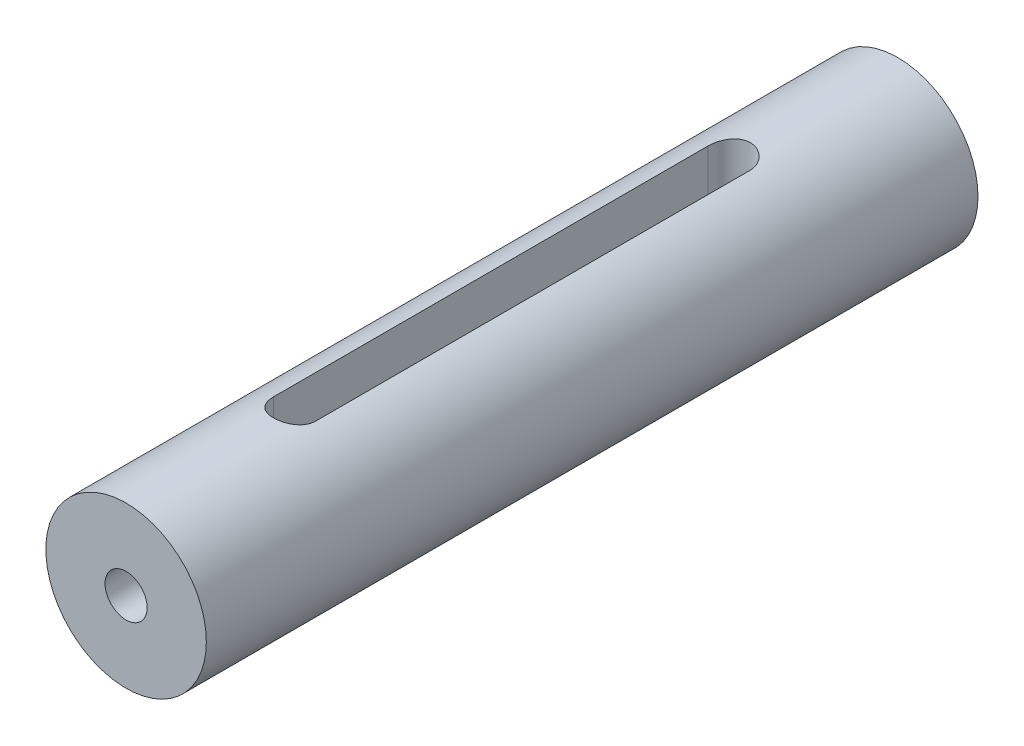
ISO-10303-21;
HEADER;
FILE_DESCRIPTION(('STEP AP214'),'2;1');
FILE_NAME('part.step','',(''),(''),'','','');
FILE_SCHEMA(('AUTOMOTIVE_DESIGN { 1 0 10303 214 1 1 1 1 }'));
ENDSEC;
DATA;
#1=APPLICATION_CONTEXT('core data for automotive mechanical design processes');
#2=APPLICATION_PROTOCOL_DEFINITION('international standard','automotive_design',2000,#1);
#3=PRODUCT_CONTEXT('',#1,'mechanical');
#4=PRODUCT('Part','Part','',(#3));
#5=PRODUCT_RELATED_PRODUCT_CATEGORY('part','',(#4));
#6=PRODUCT_DEFINITION_FORMATION('','',#4);
#7=PRODUCT_DEFINITION_CONTEXT('part definition',#1,'design');
#8=PRODUCT_DEFINITION('design','',#6,#7);
#9=PRODUCT_DEFINITION_SHAPE('','',#8);
#10=(LENGTH_UNIT() NAMED_UNIT(*) SI_UNIT(.MILLI.,.METRE.));
#11=(NAMED_UNIT(*) PLANE_ANGLE_UNIT() SI_UNIT($,.RADIAN.));
#12=(NAMED_UNIT(*) SI_UNIT($,.STERADIAN.) SOLID_ANGLE_UNIT());
#13=UNCERTAINTY_MEASURE_WITH_UNIT(LENGTH_MEASURE(1.E-05),#10,'distance_accuracy_value','');
#14=(GEOMETRIC_REPRESENTATION_CONTEXT(3) GLOBAL_UNCERTAINTY_ASSIGNED_CONTEXT((#13)) GLOBAL_UNIT_ASSIGNED_CONTEXT((#10,
#11,#12)) REPRESENTATION_CONTEXT('',''));
#15=CARTESIAN_POINT('',(0.,0.,0.));
#16=DIRECTION('',(0.,0.,1.));
#17=DIRECTION('',(1.,0.,0.));
#18=AXIS2_PLACEMENT_3D('',#15,#16,#17);
#19=CARTESIAN_POINT('',(0.,0.,-22.9));
#20=DIRECTION('',(0.,0.,-1.));
#21=DIRECTION('',(-1.,0.,0.));
#22=AXIS2_PLACEMENT_3D('',#19,#20,#21);
#23=CYLINDRICAL_SURFACE('',#22,1.25);
#24=CARTESIAN_POINT('',(0.,0.,22.9));
#25=DIRECTION('',(0.,0.,1.));
#26=DIRECTION('',(1.,0.,0.));
#27=AXIS2_PLACEMENT_3D('',#24,#25,#26);
#28=CIRCLE('',#27,1.25);
#29=CARTESIAN_POINT('',(1.25,0.,22.9));
#30=VERTEX_POINT('',#29);
#31=EDGE_CURVE('E96',#30,#30,#28,.T.);
#32=ORIENTED_EDGE('',*,*,#31,.T.);
#33=EDGE_LOOP('',(#32));
#34=FACE_BOUND('',#33,.T.);
#35=CARTESIAN_POINT('',(0.,0.,12.9));
#36=DIRECTION('',(0.,-0.707106781186548,-0.707106781186548));
#37=DIRECTION('',(0.,0.707106781186548,-0.707106781186548));
#38=AXIS2_PLACEMENT_3D('',#35,#36,#37);
#39=ELLIPSE('',#38,1.76776695296635,1.25);
#40=CARTESIAN_POINT('',(1.25,0.,12.9));
#41=VERTEX_POINT('',#40);
#42=CARTESIAN_POINT('',(-1.25,0.,12.9));
#43=VERTEX_POINT('',#42);
#44=EDGE_CURVE('E26',#41,#43,#39,.T.);
#45=ORIENTED_EDGE('',*,*,#44,.T.);
#46=CARTESIAN_POINT('',(0.,0.,12.9));
#47=DIRECTION('',(0.,0.707106781186548,-0.707106781186548));
#48=DIRECTION('',(0.,-0.707106781186548,-0.707106781186548));
#49=AXIS2_PLACEMENT_3D('',#46,#47,#48);
#50=ELLIPSE('',#49,1.76776695296635,1.25);
#51=EDGE_CURVE('E11',#43,#41,#50,.T.);
#52=ORIENTED_EDGE('',*,*,#51,.T.);
#53=EDGE_LOOP('',(#45,#52));
#54=FACE_BOUND('',#53,.T.);
#55=ADVANCED_FACE('F17',(#34,#54),#23,.F.);
#56=CARTESIAN_POINT('',(0.,0.,22.9));
#57=DIRECTION('',(0.,0.,-1.));
#58=DIRECTION('',(-1.,0.,0.));
#59=AXIS2_PLACEMENT_3D('',#56,#57,#58);
#60=CYLINDRICAL_SURFACE('',#59,4.7625);
#61=DIRECTION('',(0.,0.,-1.));
#62=VECTOR('',#61,1.);
#63=CARTESIAN_POINT('',(1.25,4.5955311172921,22.9));
#64=LINE('',#63,#62);
#65=CARTESIAN_POINT('',(1.25,4.59553111729211,12.9));
#66=VERTEX_POINT('',#65);
#67=CARTESIAN_POINT('',(1.24999999999999,4.59553111729211,-12.9));
#68=VERTEX_POINT('',#67);
#69=EDGE_CURVE('E98',#66,#68,#64,.T.);
#70=ORIENTED_EDGE('',*,*,#69,.F.);
#71=CARTESIAN_POINT('',(1.25,4.59553111729211,12.9));
#72=CARTESIAN_POINT('',(1.25000048902736,4.5955286479238,12.9345179213117));
#73=CARTESIAN_POINT('',(1.2485693032902,4.59592051769541,12.969018674951));
#74=CARTESIAN_POINT('',(1.24286445845281,4.59746747662113,13.0377609434393));
#75=CARTESIAN_POINT('',(1.23859131440264,4.59862242748127,13.0720025041249));
#76=CARTESIAN_POINT('',(1.22157342989318,4.60318484103243,13.1738167647506));
#77=CARTESIAN_POINT('',(1.20462994333003,4.60769016639574,13.2406878773743));
#78=CARTESIAN_POINT('',(1.16010279325713,4.61910039624271,13.3705082038057));
#79=CARTESIAN_POINT('',(1.13252075573568,4.62600493401654,13.4334580152355));
#80=CARTESIAN_POINT('',(1.0675355660721,4.64143145252666,13.5538718379911));
#81=CARTESIAN_POINT('',(1.03012932683172,4.64995394144449,13.6113341171946));
#82=CARTESIAN_POINT('',(0.945599055025138,4.66788502503618,13.7204947238532));
#83=CARTESIAN_POINT('',(0.89828152818992,4.6773088498653,13.7720406779936));
#84=CARTESIAN_POINT('',(0.795683985172516,4.69584994740788,13.8665677196036));
#85=CARTESIAN_POINT('',(0.740402684203621,4.7049671703643,13.9095474224178));
#86=CARTESIAN_POINT('',(0.622389191948358,4.72203786646922,13.986353202254));
#87=CARTESIAN_POINT('',(0.55955492300916,4.72997114379831,14.0200273093949));
#88=CARTESIAN_POINT('',(0.428877020355979,4.74360406822787,14.0762745641197));
#89=CARTESIAN_POINT('',(0.361034446460359,4.74930418629104,14.0988500526059));
#90=CARTESIAN_POINT('',(0.223862569075424,4.75772073895595,14.1317667400955));
#91=CARTESIAN_POINT('',(0.1545997732365,4.76050064256882,14.1423685807492));
#92=CARTESIAN_POINT('',(0.0152251018159413,4.76298530075748,14.1518566521175));
#93=CARTESIAN_POINT('',(-0.0548866530882486,4.76269048738806,14.1507445288612));
#94=CARTESIAN_POINT('',(-0.192153438667803,4.7591055026909,14.1370203363943));
#95=CARTESIAN_POINT('',(-0.25933885068578,4.75588872866913,14.1246900464334));
#96=CARTESIAN_POINT('',(-0.390650712032721,4.74690762656633,14.0893343048209));
#97=CARTESIAN_POINT('',(-0.454777018505625,4.74114317964122,14.0663083542346));
#98=CARTESIAN_POINT('',(-0.578877059697963,4.72760460910888,14.0099956012963));
#99=CARTESIAN_POINT('',(-0.638804334307196,4.71981148250837,13.9766111688396));
#100=CARTESIAN_POINT('',(-0.752301587943209,4.70305694044625,13.900604350469));
#101=CARTESIAN_POINT('',(-0.805870492017471,4.69409532797514,13.8579804059468));
#102=CARTESIAN_POINT('',(-0.906807851504437,4.67566242559317,13.7632106782754));
#103=CARTESIAN_POINT('',(-0.953945243952669,4.66618390239526,13.7108199502883));
#104=CARTESIAN_POINT('',(-1.0388307939855,4.6480239902343,13.5987639865178));
#105=CARTESIAN_POINT('',(-1.07657636292829,4.63934282145884,13.5390967518692));
#106=CARTESIAN_POINT('',(-1.14177877814752,4.62373040341765,13.4136827999014));
#107=CARTESIAN_POINT('',(-1.16916888446339,4.61681059624816,13.3478999408521));
#108=CARTESIAN_POINT('',(-1.21239169501967,4.60565079860737,13.2124744731729));
#109=CARTESIAN_POINT('',(-1.22824173692918,4.60140678933727,13.1428378245235));
#110=CARTESIAN_POINT('',(-1.24203535165043,4.59769140884182,13.0438218322511));
#111=CARTESIAN_POINT('',(-1.2450224317776,4.59688266680497,13.0151214131618));
#112=CARTESIAN_POINT('',(-1.24900260644867,4.59580269375071,12.9576186133938));
#113=CARTESIAN_POINT('',(-1.24999887505704,4.59553060712194,12.928816468481));
#114=CARTESIAN_POINT('',(-1.25,4.5955311172921,12.9));
#115=B_SPLINE_CURVE_WITH_KNOTS('',3,(#71,#72,#73,#74,#75,#76,#77,#78,#79,#80,#81,#82,#83,#84,
#85,#86,#87,#88,#89,#90,#91,#92,#93,#94,#95,#96,#97,#98,#99,#100,#101,#102,#103,#104,#105,#106,
#107,#108,#109,#110,#111,#112,#113,#114),.UNSPECIFIED.,.F.,.F.,(4,2,2,2,2,2,2,2,2,2,2,2,2,2,2,2,
2,2,2,2,2,4),(0.,0.103488145890121,0.206957541660808,0.413278033675284,0.619567004305238,
0.825920875664781,1.0367585509506,1.24763027861228,1.46176574771307,1.67585603231848,
1.88519033835582,2.09449522943416,2.29868368939045,2.50288167535393,2.70906592403441,
2.91528498093169,3.12762120434211,3.34001588871633,3.5537570025748,3.76717632768164,
3.85371688959778,3.94011936451478),.UNSPECIFIED.);
#116=CARTESIAN_POINT('',(-1.25,4.59553111729211,12.9));
#117=VERTEX_POINT('',#116);
#118=EDGE_CURVE('E91',#66,#117,#115,.T.);
#119=ORIENTED_EDGE('',*,*,#118,.T.);
#120=DIRECTION('',(0.,0.,-1.));
#121=VECTOR('',#120,1.);
#122=CARTESIAN_POINT('',(-1.25,4.5955311172921,22.9));
#123=LINE('',#122,#121);
#124=CARTESIAN_POINT('',(-1.25,4.59553111729211,-12.9));
#125=VERTEX_POINT('',#124);
#126=EDGE_CURVE('E85',#117,#125,#123,.T.);
#127=ORIENTED_EDGE('',*,*,#126,.T.);
#128=CARTESIAN_POINT('',(-1.25,4.59553111729211,-12.9));
#129=CARTESIAN_POINT('',(-1.25000048902736,4.5955286479238,-12.9345179213117));
#130=CARTESIAN_POINT('',(-1.24856930329021,4.59592051769541,-12.969018674951));
#131=CARTESIAN_POINT('',(-1.24286445845282,4.59746747662113,-13.0377609434393));
#132=CARTESIAN_POINT('',(-1.23859131440265,4.59862242748127,-13.0720025041249));
#133=CARTESIAN_POINT('',(-1.22157342989319,4.60318484103242,-13.1738167647506));
#134=CARTESIAN_POINT('',(-1.20462994333003,4.60769016639573,-13.2406878773743));
#135=CARTESIAN_POINT('',(-1.16010279325713,4.6191003962427,-13.3705082038057));
#136=CARTESIAN_POINT('',(-1.13252075573568,4.62600493401654,-13.4334580152355));
#137=CARTESIAN_POINT('',(-1.06753556607211,4.64143145252666,-13.5538718379911));
#138=CARTESIAN_POINT('',(-1.03012932683172,4.64995394144449,-13.6113341171946));
#139=CARTESIAN_POINT('',(-0.945599055025144,4.66788502503618,-13.7204947238532));
#140=CARTESIAN_POINT('',(-0.898281528189926,4.6773088498653,-13.7720406779936));
#141=CARTESIAN_POINT('',(-0.795683985172523,4.69584994740788,-13.8665677196036));
#142=CARTESIAN_POINT('',(-0.740402684203629,4.7049671703643,-13.9095474224178));
#143=CARTESIAN_POINT('',(-0.622389191948366,4.72203786646922,-13.986353202254));
#144=CARTESIAN_POINT('',(-0.559554923009168,4.72997114379831,-14.0200273093949));
#145=CARTESIAN_POINT('',(-0.428877020355986,4.74360406822787,-14.0762745641197));
#146=CARTESIAN_POINT('',(-0.361034446460366,4.74930418629104,-14.0988500526059));
#147=CARTESIAN_POINT('',(-0.223862569075431,4.75772073895595,-14.1317667400955));
#148=CARTESIAN_POINT('',(-0.154599773236507,4.76050064256882,-14.1423685807492));
#149=CARTESIAN_POINT('',(-0.0152251018159484,4.76298530075748,-14.1518566521175));
#150=CARTESIAN_POINT('',(0.0548866530882414,4.76269048738806,-14.1507445288612));
#151=CARTESIAN_POINT('',(0.192153438667796,4.7591055026909,-14.1370203363943));
#152=CARTESIAN_POINT('',(0.259338850685773,4.75588872866913,-14.1246900464334));
#153=CARTESIAN_POINT('',(0.390650712032714,4.74690762656633,-14.0893343048209));
#154=CARTESIAN_POINT('',(0.454777018505618,4.74114317964122,-14.0663083542346));
#155=CARTESIAN_POINT('',(0.578877059697956,4.72760460910888,-14.0099956012963));
#156=CARTESIAN_POINT('',(0.63880433430719,4.71981148250837,-13.9766111688396));
#157=CARTESIAN_POINT('',(0.752301587943202,4.70305694044625,-13.900604350469));
#158=CARTESIAN_POINT('',(0.805870492017464,4.69409532797514,-13.8579804059468));
#159=CARTESIAN_POINT('',(0.90680785150443,4.67566242559317,-13.7632106782754));
#160=CARTESIAN_POINT('',(0.953945243952663,4.66618390239526,-13.7108199502883));
#161=CARTESIAN_POINT('',(1.03883079398549,4.6480239902343,-13.5987639865178));
#162=CARTESIAN_POINT('',(1.07657636292828,4.63934282145884,-13.5390967518692));
#163=CARTESIAN_POINT('',(1.14177877814752,4.62373040341765,-13.4136827999014));
#164=CARTESIAN_POINT('',(1.16916888446338,4.61681059624816,-13.3478999408521));
#165=CARTESIAN_POINT('',(1.21239169501966,4.60565079860738,-13.2124744731729));
#166=CARTESIAN_POINT('',(1.22824173692918,4.60140678933727,-13.1428378245235));
#167=CARTESIAN_POINT('',(1.24203535165043,4.59769140884182,-13.0438218322511));
#168=CARTESIAN_POINT('',(1.2450224317776,4.59688266680497,-13.0151214131618));
#169=CARTESIAN_POINT('',(1.24900260644866,4.59580269375071,-12.9576186133938));
#170=CARTESIAN_POINT('',(1.24999887505703,4.59553060712194,-12.928816468481));
#171=CARTESIAN_POINT('',(1.24999999999999,4.59553111729211,-12.9));
#172=B_SPLINE_CURVE_WITH_KNOTS('',3,(#128,#129,#130,#131,#132,#133,#134,#135,#136,#137,#138,
#139,#140,#141,#142,#143,#144,#145,#146,#147,#148,#149,#150,#151,#152,#153,#154,#155,#156,#157,
#158,#159,#160,#161,#162,#163,#164,#165,#166,#167,#168,#169,#170,#171),.UNSPECIFIED.,.F.,.F.,(4,
2,2,2,2,2,2,2,2,2,2,2,2,2,2,2,2,2,2,2,2,4),(0.,0.10348814589012,0.20695754166081,
0.413278033675284,0.61956700430524,0.825920875664781,1.0367585509506,1.24763027861228,
1.46176574771307,1.67585603231848,1.88519033835582,2.09449522943416,2.29868368939045,
2.50288167535393,2.70906592403441,2.91528498093169,3.12762120434211,3.34001588871633,
3.5537570025748,3.76717632768164,3.85371688959778,3.94011936451478),.UNSPECIFIED.);
#173=EDGE_CURVE('E33',#125,#68,#172,.T.);
#174=ORIENTED_EDGE('',*,*,#173,.T.);
#175=EDGE_LOOP('',(#70,#119,#127,#174));
#176=FACE_BOUND('',#175,.T.);
#177=DIRECTION('',(0.,0.,-1.));
#178=VECTOR('',#177,1.);
#179=CARTESIAN_POINT('',(-1.25,-4.5955311172921,22.9));
#180=LINE('',#179,#178);
#181=CARTESIAN_POINT('',(-1.25,-4.5955311172921,-12.9));
#182=VERTEX_POINT('',#181);
#183=CARTESIAN_POINT('',(-1.25,-4.5955311172921,12.9));
#184=VERTEX_POINT('',#183);
#185=EDGE_CURVE('E93',#182,#184,#180,.F.);
#186=ORIENTED_EDGE('',*,*,#185,.T.);
#187=CARTESIAN_POINT('',(-1.25,-4.5955311172921,12.9));
#188=CARTESIAN_POINT('',(-1.25000048902736,-4.5955286479238,12.9345179213117));
#189=CARTESIAN_POINT('',(-1.24856930329021,-4.59592051769541,12.969018674951));
#190=CARTESIAN_POINT('',(-1.24286445845281,-4.59746747662113,13.0377609434393));
#191=CARTESIAN_POINT('',(-1.23859131440265,-4.59862242748127,13.0720025041249));
#192=CARTESIAN_POINT('',(-1.22157342989318,-4.60318484103243,13.1738167647506));
#193=CARTESIAN_POINT('',(-1.20462994333003,-4.60769016639574,13.2406878773743));
#194=CARTESIAN_POINT('',(-1.16010279325713,-4.61910039624271,13.3705082038057));
#195=CARTESIAN_POINT('',(-1.13252075573568,-4.62600493401654,13.4334580152355));
#196=CARTESIAN_POINT('',(-1.0675355660721,-4.64143145252666,13.5538718379911));
#197=CARTESIAN_POINT('',(-1.03012932683172,-4.64995394144449,13.6113341171946));
#198=CARTESIAN_POINT('',(-0.945599055025141,-4.66788502503618,13.7204947238532));
#199=CARTESIAN_POINT('',(-0.898281528189923,-4.6773088498653,13.7720406779936));
#200=CARTESIAN_POINT('',(-0.79568398517252,-4.69584994740788,13.8665677196036));
#201=CARTESIAN_POINT('',(-0.740402684203624,-4.7049671703643,13.9095474224178));
#202=CARTESIAN_POINT('',(-0.622389191948361,-4.72203786646922,13.986353202254));
#203=CARTESIAN_POINT('',(-0.559554923009164,-4.72997114379831,14.0200273093949));
#204=CARTESIAN_POINT('',(-0.428877020355983,-4.74360406822788,14.0762745641197));
#205=CARTESIAN_POINT('',(-0.361034446460362,-4.74930418629104,14.0988500526059));
#206=CARTESIAN_POINT('',(-0.223862569075427,-4.75772073895595,14.1317667400955));
#207=CARTESIAN_POINT('',(-0.154599773236503,-4.76050064256882,14.1423685807492));
#208=CARTESIAN_POINT('',(-0.0152251018159444,-4.76298530075748,14.1518566521175));
#209=CARTESIAN_POINT('',(0.0548866530882452,-4.76269048738806,14.1507445288612));
#210=CARTESIAN_POINT('',(0.1921534386678,-4.7591055026909,14.1370203363943));
#211=CARTESIAN_POINT('',(0.259338850685776,-4.75588872866913,14.1246900464334));
#212=CARTESIAN_POINT('',(0.390650712032717,-4.74690762656633,14.0893343048209));
#213=CARTESIAN_POINT('',(0.454777018505621,-4.74114317964122,14.0663083542346));
#214=CARTESIAN_POINT('',(0.578877059697959,-4.72760460910888,14.0099956012963));
#215=CARTESIAN_POINT('',(0.638804334307192,-4.71981148250837,13.9766111688396));
#216=CARTESIAN_POINT('',(0.752301587943204,-4.70305694044625,13.900604350469));
#217=CARTESIAN_POINT('',(0.805870492017467,-4.69409532797514,13.8579804059468));
#218=CARTESIAN_POINT('',(0.906807851504433,-4.67566242559317,13.7632106782754));
#219=CARTESIAN_POINT('',(0.953945243952666,-4.66618390239526,13.7108199502883));
#220=CARTESIAN_POINT('',(1.0388307939855,-4.6480239902343,13.5987639865178));
#221=CARTESIAN_POINT('',(1.07657636292829,-4.63934282145884,13.5390967518692));
#222=CARTESIAN_POINT('',(1.14177877814752,-4.62373040341765,13.4136827999014));
#223=CARTESIAN_POINT('',(1.16916888446339,-4.61681059624816,13.3478999408521));
#224=CARTESIAN_POINT('',(1.21239169501966,-4.60565079860738,13.2124744731729));
#225=CARTESIAN_POINT('',(1.22824173692918,-4.60140678933727,13.1428378245235));
#226=CARTESIAN_POINT('',(1.24203535165043,-4.59769140884182,13.0438218322511));
#227=CARTESIAN_POINT('',(1.2450224317776,-4.59688266680497,13.0151214131618));
#228=CARTESIAN_POINT('',(1.24900260644866,-4.59580269375071,12.9576186133938));
#229=CARTESIAN_POINT('',(1.24999887505704,-4.59553060712194,12.928816468481));
#230=CARTESIAN_POINT('',(1.25,-4.59553111729211,12.9));
#231=B_SPLINE_CURVE_WITH_KNOTS('',3,(#187,#188,#189,#190,#191,#192,#193,#194,#195,#196,#197,
#198,#199,#200,#201,#202,#203,#204,#205,#206,#207,#208,#209,#210,#211,#212,#213,#214,#215,#216,
#217,#218,#219,#220,#221,#222,#223,#224,#225,#226,#227,#228,#229,#230),.UNSPECIFIED.,.F.,.F.,(4,
2,2,2,2,2,2,2,2,2,2,2,2,2,2,2,2,2,2,2,2,4),(0.,0.103488145890121,0.206957541660808,
0.413278033675284,0.619567004305242,0.825920875664781,1.0367585509506,1.24763027861228,
1.46176574771307,1.67585603231848,1.88519033835582,2.09449522943416,2.29868368939045,
2.50288167535393,2.7090659240344,2.91528498093169,3.12762120434211,3.34001588871633,
3.5537570025748,3.76717632768164,3.85371688959778,3.94011936451478),.UNSPECIFIED.);
#232=CARTESIAN_POINT('',(1.25,-4.5955311172921,12.9));
#233=VERTEX_POINT('',#232);
#234=EDGE_CURVE('E79',#184,#233,#231,.T.);
#235=ORIENTED_EDGE('',*,*,#234,.T.);
#236=DIRECTION('',(0.,0.,-1.));
#237=VECTOR('',#236,1.);
#238=CARTESIAN_POINT('',(1.25,-4.5955311172921,22.9));
#239=LINE('',#238,#237);
#240=CARTESIAN_POINT('',(1.25,-4.5955311172921,-12.9));
#241=VERTEX_POINT('',#240);
#242=EDGE_CURVE('E135',#241,#233,#239,.F.);
#243=ORIENTED_EDGE('',*,*,#242,.F.);
#244=CARTESIAN_POINT('',(1.24999999999999,-4.59553111729211,-12.9));
#245=CARTESIAN_POINT('',(1.25000048902735,-4.5955286479238,-12.9345179213117));
#246=CARTESIAN_POINT('',(1.2485693032902,-4.59592051769541,-12.969018674951));
#247=CARTESIAN_POINT('',(1.24286445845281,-4.59746747662113,-13.0377609434393));
#248=CARTESIAN_POINT('',(1.23859131440264,-4.59862242748127,-13.0720025041249));
#249=CARTESIAN_POINT('',(1.22157342989318,-4.60318484103243,-13.1738167647506));
#250=CARTESIAN_POINT('',(1.20462994333002,-4.60769016639574,-13.2406878773743));
#251=CARTESIAN_POINT('',(1.16010279325712,-4.61910039624271,-13.3705082038057));
#252=CARTESIAN_POINT('',(1.13252075573567,-4.62600493401654,-13.4334580152355));
#253=CARTESIAN_POINT('',(1.0675355660721,-4.64143145252666,-13.5538718379911));
#254=CARTESIAN_POINT('',(1.03012932683171,-4.64995394144449,-13.6113341171946));
#255=CARTESIAN_POINT('',(0.945599055025135,-4.66788502503618,-13.7204947238532));
#256=CARTESIAN_POINT('',(0.898281528189917,-4.67730884986531,-13.7720406779936));
#257=CARTESIAN_POINT('',(0.795683985172514,-4.69584994740788,-13.8665677196036));
#258=CARTESIAN_POINT('',(0.74040268420362,-4.7049671703643,-13.9095474224178));
#259=CARTESIAN_POINT('',(0.622389191948357,-4.72203786646922,-13.986353202254));
#260=CARTESIAN_POINT('',(0.559554923009159,-4.72997114379831,-14.0200273093949));
#261=CARTESIAN_POINT('',(0.428877020355977,-4.74360406822788,-14.0762745641197));
#262=CARTESIAN_POINT('',(0.361034446460357,-4.74930418629104,-14.0988500526059));
#263=CARTESIAN_POINT('',(0.223862569075422,-4.75772073895595,-14.1317667400955));
#264=CARTESIAN_POINT('',(0.154599773236497,-4.76050064256882,-14.1423685807492));
#265=CARTESIAN_POINT('',(0.0152251018159387,-4.76298530075748,-14.1518566521175));
#266=CARTESIAN_POINT('',(-0.0548866530882509,-4.76269048738806,-14.1507445288612));
#267=CARTESIAN_POINT('',(-0.192153438667805,-4.7591055026909,-14.1370203363943));
#268=CARTESIAN_POINT('',(-0.259338850685782,-4.75588872866913,-14.1246900464334));
#269=CARTESIAN_POINT('',(-0.390650712032723,-4.74690762656633,-14.0893343048209));
#270=CARTESIAN_POINT('',(-0.454777018505627,-4.74114317964122,-14.0663083542346));
#271=CARTESIAN_POINT('',(-0.578877059697965,-4.72760460910888,-14.0099956012963));
#272=CARTESIAN_POINT('',(-0.638804334307198,-4.71981148250837,-13.9766111688396));
#273=CARTESIAN_POINT('',(-0.752301587943211,-4.70305694044625,-13.900604350469));
#274=CARTESIAN_POINT('',(-0.805870492017473,-4.69409532797514,-13.8579804059468));
#275=CARTESIAN_POINT('',(-0.906807851504439,-4.67566242559317,-13.7632106782754));
#276=CARTESIAN_POINT('',(-0.953945243952673,-4.66618390239525,-13.7108199502883));
#277=CARTESIAN_POINT('',(-1.0388307939855,-4.6480239902343,-13.5987639865178));
#278=CARTESIAN_POINT('',(-1.07657636292829,-4.63934282145884,-13.5390967518692));
#279=CARTESIAN_POINT('',(-1.14177877814753,-4.62373040341765,-13.4136827999014));
#280=CARTESIAN_POINT('',(-1.16916888446339,-4.61681059624816,-13.3478999408521));
#281=CARTESIAN_POINT('',(-1.21239169501967,-4.60565079860737,-13.2124744731729));
#282=CARTESIAN_POINT('',(-1.22824173692919,-4.60140678933727,-13.1428378245235));
#283=CARTESIAN_POINT('',(-1.24203535165044,-4.59769140884182,-13.0438218322511));
#284=CARTESIAN_POINT('',(-1.24502243177761,-4.59688266680497,-13.0151214131618));
#285=CARTESIAN_POINT('',(-1.24900260644867,-4.59580269375071,-12.9576186133938));
#286=CARTESIAN_POINT('',(-1.24999887505704,-4.59553060712193,-12.928816468481));
#287=CARTESIAN_POINT('',(-1.25,-4.5955311172921,-12.9));
#288=B_SPLINE_CURVE_WITH_KNOTS('',3,(#244,#245,#246,#247,#248,#249,#250,#251,#252,#253,#254,
#255,#256,#257,#258,#259,#260,#261,#262,#263,#264,#265,#266,#267,#268,#269,#270,#271,#272,#273,
#274,#275,#276,#277,#278,#279,#280,#281,#282,#283,#284,#285,#286,#287),.UNSPECIFIED.,.F.,.F.,(4,
2,2,2,2,2,2,2,2,2,2,2,2,2,2,2,2,2,2,2,2,4),(0.,0.10348814589012,0.206957541660808,
0.413278033675284,0.619567004305241,0.82592087566478,1.0367585509506,1.24763027861227,
1.46176574771307,1.67585603231848,1.88519033835582,2.09449522943416,2.29868368939044,
2.50288167535393,2.7090659240344,2.91528498093169,3.12762120434211,3.34001588871633,
3.5537570025748,3.76717632768165,3.85371688959778,3.94011936451478),.UNSPECIFIED.);
#289=EDGE_CURVE('E41',#241,#182,#288,.T.);
#290=ORIENTED_EDGE('',*,*,#289,.T.);
#291=EDGE_LOOP('',(#186,#235,#243,#290));
#292=FACE_BOUND('',#291,.T.);
#293=CARTESIAN_POINT('',(0.,0.,22.9));
#294=DIRECTION('',(0.,0.,1.));
#295=DIRECTION('',(1.,0.,0.));
#296=AXIS2_PLACEMENT_3D('',#293,#294,#295);
#297=CIRCLE('',#296,4.7625);
#298=CARTESIAN_POINT('',(4.7625,0.,22.9));
#299=VERTEX_POINT('',#298);
#300=EDGE_CURVE('E105',#299,#299,#297,.T.);
#301=ORIENTED_EDGE('',*,*,#300,.F.);
#302=EDGE_LOOP('',(#301));
#303=FACE_BOUND('',#302,.T.);
#304=CARTESIAN_POINT('',(0.,0.,-22.9));
#305=DIRECTION('',(0.,0.,1.));
#306=DIRECTION('',(1.,0.,0.));
#307=AXIS2_PLACEMENT_3D('',#304,#305,#306);
#308=CIRCLE('',#307,4.7625);
#309=CARTESIAN_POINT('',(4.7625,0.,-22.9));
#310=VERTEX_POINT('',#309);
#311=EDGE_CURVE('E104',#310,#310,#308,.T.);
#312=ORIENTED_EDGE('',*,*,#311,.T.);
#313=EDGE_LOOP('',(#312));
#314=FACE_BOUND('',#313,.T.);
#315=ADVANCED_FACE('F19',(#176,#292,#303,#314),#60,.T.);
#316=CARTESIAN_POINT('',(0.,0.,22.9));
#317=DIRECTION('',(0.,0.,1.));
#318=DIRECTION('',(1.,0.,0.));
#319=AXIS2_PLACEMENT_3D('',#316,#317,#318);
#320=PLANE('',#319);
#321=ORIENTED_EDGE('',*,*,#31,.F.);
#322=EDGE_LOOP('',(#321));
#323=FACE_BOUND('',#322,.T.);
#324=ORIENTED_EDGE('',*,*,#300,.T.);
#325=EDGE_LOOP('',(#324));
#326=FACE_BOUND('',#325,.T.);
#327=ADVANCED_FACE('F181',(#323,#326),#320,.T.);
#328=CARTESIAN_POINT('',(0.,0.,-22.9));
#329=DIRECTION('',(0.,0.,1.));
#330=DIRECTION('',(1.,0.,0.));
#331=AXIS2_PLACEMENT_3D('',#328,#329,#330);
#332=PLANE('',#331);
#333=CARTESIAN_POINT('',(0.,0.,-22.9));
#334=DIRECTION('',(0.,0.,-1.));
#335=DIRECTION('',(-1.,0.,0.));
#336=AXIS2_PLACEMENT_3D('',#333,#334,#335);
#337=CIRCLE('',#336,1.25);
#338=CARTESIAN_POINT('',(-1.25,0.,-22.9));
#339=VERTEX_POINT('',#338);
#340=EDGE_CURVE('E92',#339,#339,#337,.T.);
#341=ORIENTED_EDGE('',*,*,#340,.F.);
#342=EDGE_LOOP('',(#341));
#343=FACE_BOUND('',#342,.T.);
#344=ORIENTED_EDGE('',*,*,#311,.F.);
#345=EDGE_LOOP('',(#344));
#346=FACE_BOUND('',#345,.T.);
#347=ADVANCED_FACE('F176',(#343,#346),#332,.F.);
#348=CARTESIAN_POINT('',(0.,0.,-12.9));
#349=DIRECTION('',(0.,-0.707106781186548,-0.707106781186548));
#350=DIRECTION('',(0.,0.707106781186548,-0.707106781186548));
#351=AXIS2_PLACEMENT_3D('',#348,#349,#350);
#352=ELLIPSE('',#351,1.76776695296635,1.25);
#353=CARTESIAN_POINT('',(1.25,0.,-12.9));
#354=VERTEX_POINT('',#353);
#355=CARTESIAN_POINT('',(-1.25,0.,-12.9));
#356=VERTEX_POINT('',#355);
#357=EDGE_CURVE('E108',#354,#356,#352,.F.);
#358=ORIENTED_EDGE('',*,*,#357,.T.);
#359=CARTESIAN_POINT('',(0.,0.,-12.9));
#360=DIRECTION('',(0.,0.707106781186548,-0.707106781186548));
#361=DIRECTION('',(0.,-0.707106781186548,-0.707106781186548));
#362=AXIS2_PLACEMENT_3D('',#359,#360,#361);
#363=ELLIPSE('',#362,1.76776695296635,1.25);
#364=EDGE_CURVE('E113',#356,#354,#363,.F.);
#365=ORIENTED_EDGE('',*,*,#364,.T.);
#366=EDGE_LOOP('',(#358,#365));
#367=FACE_BOUND('',#366,.T.);
#368=ORIENTED_EDGE('',*,*,#340,.T.);
#369=EDGE_LOOP('',(#368));
#370=FACE_BOUND('',#369,.T.);
#371=ADVANCED_FACE('F158',(#367,#370),#23,.F.);
#372=CARTESIAN_POINT('',(-1.25,-4.7625,0.));
#373=DIRECTION('',(-1.,0.,0.));
#374=DIRECTION('',(0.,0.,1.));
#375=AXIS2_PLACEMENT_3D('',#372,#373,#374);
#376=PLANE('',#375);
#377=DIRECTION('',(0.,1.,0.));
#378=VECTOR('',#377,1.);
#379=CARTESIAN_POINT('',(-1.25,-4.7625,12.9));
#380=LINE('',#379,#378);
#381=EDGE_CURVE('E271',#43,#117,#380,.T.);
#382=ORIENTED_EDGE('',*,*,#381,.F.);
#383=EDGE_CURVE('E125',#184,#43,#380,.T.);
#384=ORIENTED_EDGE('',*,*,#383,.F.);
#385=ORIENTED_EDGE('',*,*,#185,.F.);
#386=DIRECTION('',(0.,1.,0.));
#387=VECTOR('',#386,1.);
#388=CARTESIAN_POINT('',(-1.25,-4.7625,-12.9));
#389=LINE('',#388,#387);
#390=EDGE_CURVE('E88',#182,#356,#389,.T.);
#391=ORIENTED_EDGE('',*,*,#390,.T.);
#392=EDGE_CURVE('E74',#356,#125,#389,.T.);
#393=ORIENTED_EDGE('',*,*,#392,.T.);
#394=ORIENTED_EDGE('',*,*,#126,.F.);
#395=EDGE_LOOP('',(#382,#384,#385,#391,#393,#394));
#396=FACE_BOUND('',#395,.T.);
#397=ADVANCED_FACE('F84',(#396),#376,.F.);
#398=CARTESIAN_POINT('',(1.25,-4.7625,0.));
#399=DIRECTION('',(-1.,0.,0.));
#400=DIRECTION('',(0.,0.,1.));
#401=AXIS2_PLACEMENT_3D('',#398,#399,#400);
#402=PLANE('',#401);
#403=ORIENTED_EDGE('',*,*,#69,.T.);
#404=DIRECTION('',(0.,1.,0.));
#405=VECTOR('',#404,1.);
#406=CARTESIAN_POINT('',(1.25,-4.7625,-12.9));
#407=LINE('',#406,#405);
#408=EDGE_CURVE('E77',#354,#68,#407,.T.);
#409=ORIENTED_EDGE('',*,*,#408,.F.);
#410=EDGE_CURVE('E89',#241,#354,#407,.T.);
#411=ORIENTED_EDGE('',*,*,#410,.F.);
#412=ORIENTED_EDGE('',*,*,#242,.T.);
#413=DIRECTION('',(0.,1.,0.));
#414=VECTOR('',#413,1.);
#415=CARTESIAN_POINT('',(1.25,-4.7625,12.9));
#416=LINE('',#415,#414);
#417=EDGE_CURVE('E123',#233,#41,#416,.T.);
#418=ORIENTED_EDGE('',*,*,#417,.T.);
#419=EDGE_CURVE('E128',#41,#66,#416,.T.);
#420=ORIENTED_EDGE('',*,*,#419,.T.);
#421=EDGE_LOOP('',(#403,#409,#411,#412,#418,#420));
#422=FACE_BOUND('',#421,.T.);
#423=ADVANCED_FACE('F133',(#422),#402,.T.);
#424=CARTESIAN_POINT('',(0.,-4.7625,12.9));
#425=DIRECTION('',(0.,1.,0.));
#426=DIRECTION('',(0.,0.,1.));
#427=AXIS2_PLACEMENT_3D('',#424,#425,#426);
#428=CYLINDRICAL_SURFACE('',#427,1.25);
#429=ORIENTED_EDGE('',*,*,#419,.F.);
#430=ORIENTED_EDGE('',*,*,#51,.F.);
#431=ORIENTED_EDGE('',*,*,#381,.T.);
#432=ORIENTED_EDGE('',*,*,#118,.F.);
#433=EDGE_LOOP('',(#429,#430,#431,#432));
#434=FACE_BOUND('',#433,.T.);
#435=ADVANCED_FACE('F129',(#434),#428,.F.);
#436=ORIENTED_EDGE('',*,*,#383,.T.);
#437=ORIENTED_EDGE('',*,*,#44,.F.);
#438=ORIENTED_EDGE('',*,*,#417,.F.);
#439=ORIENTED_EDGE('',*,*,#234,.F.);
#440=EDGE_LOOP('',(#436,#437,#438,#439));
#441=FACE_BOUND('',#440,.T.);
#442=ADVANCED_FACE('F121',(#441),#428,.F.);
#443=CARTESIAN_POINT('',(0.,-4.7625,-12.9));
#444=DIRECTION('',(0.,1.,0.));
#445=DIRECTION('',(0.,0.,1.));
#446=AXIS2_PLACEMENT_3D('',#443,#444,#445);
#447=CYLINDRICAL_SURFACE('',#446,1.25);
#448=ORIENTED_EDGE('',*,*,#392,.F.);
#449=ORIENTED_EDGE('',*,*,#357,.F.);
#450=ORIENTED_EDGE('',*,*,#408,.T.);
#451=ORIENTED_EDGE('',*,*,#173,.F.);
#452=EDGE_LOOP('',(#448,#449,#450,#451));
#453=FACE_BOUND('',#452,.T.);
#454=ADVANCED_FACE('F73',(#453),#447,.F.);
#455=ORIENTED_EDGE('',*,*,#410,.T.);
#456=ORIENTED_EDGE('',*,*,#364,.F.);
#457=ORIENTED_EDGE('',*,*,#390,.F.);
#458=ORIENTED_EDGE('',*,*,#289,.F.);
#459=EDGE_LOOP('',(#455,#456,#457,#458));
#460=FACE_BOUND('',#459,.T.);
#461=ADVANCED_FACE('F152',(#460),#447,.F.);
#462=CLOSED_SHELL('',(#55,#315,#327,#347,#371,#397,#423,#435,#442,#454,#461));
#463=MANIFOLD_SOLID_BREP('B1',#462);
#464=ADVANCED_BREP_SHAPE_REPRESENTATION('',(#18,#463),#14);
#465=SHAPE_DEFINITION_REPRESENTATION(#9,#464);
ENDSEC;
END-ISO-10303-21;
